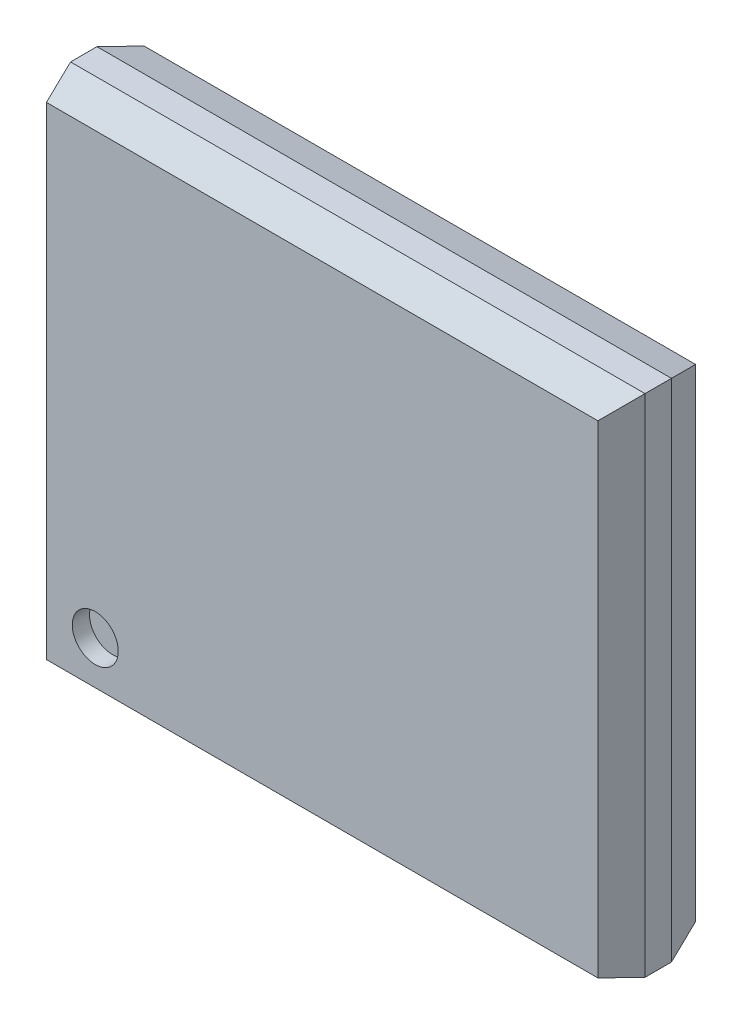
ISO-10303-21;
HEADER;
FILE_DESCRIPTION(('STEP AP214'),'2;1');
FILE_NAME('part.step','',(''),(''),'','','');
FILE_SCHEMA(('AUTOMOTIVE_DESIGN { 1 0 10303 214 1 1 1 1 }'));
ENDSEC;
DATA;
#1=APPLICATION_CONTEXT('core data for automotive mechanical design processes');
#2=APPLICATION_PROTOCOL_DEFINITION('international standard','automotive_design',2000,#1);
#3=PRODUCT_CONTEXT('',#1,'mechanical');
#4=PRODUCT('Part','Part','',(#3));
#5=PRODUCT_RELATED_PRODUCT_CATEGORY('part','',(#4));
#6=PRODUCT_DEFINITION_FORMATION('','',#4);
#7=PRODUCT_DEFINITION_CONTEXT('part definition',#1,'design');
#8=PRODUCT_DEFINITION('design','',#6,#7);
#9=PRODUCT_DEFINITION_SHAPE('','',#8);
#10=(LENGTH_UNIT() NAMED_UNIT(*) SI_UNIT(.MILLI.,.METRE.));
#11=(NAMED_UNIT(*) PLANE_ANGLE_UNIT() SI_UNIT($,.RADIAN.));
#12=(NAMED_UNIT(*) SI_UNIT($,.STERADIAN.) SOLID_ANGLE_UNIT());
#13=UNCERTAINTY_MEASURE_WITH_UNIT(LENGTH_MEASURE(1.E-05),#10,'distance_accuracy_value','');
#14=(GEOMETRIC_REPRESENTATION_CONTEXT(3) GLOBAL_UNCERTAINTY_ASSIGNED_CONTEXT((#13)) GLOBAL_UNIT_ASSIGNED_CONTEXT((#10,
#11,#12)) REPRESENTATION_CONTEXT('',''));
#15=CARTESIAN_POINT('',(0.,0.,0.));
#16=DIRECTION('',(0.,0.,1.));
#17=DIRECTION('',(1.,0.,0.));
#18=AXIS2_PLACEMENT_3D('',#15,#16,#17);
#19=CARTESIAN_POINT('',(0.,2.1,0.15));
#20=DIRECTION('',(0.,0.951708617760523,-0.307002779922846));
#21=DIRECTION('',(-1.,0.,0.));
#22=AXIS2_PLACEMENT_3D('',#19,#20,#21);
#23=PLANE('',#22);
#24=DIRECTION('',(-0.293483635441928,0.293483635441928,0.909799269869777));
#25=VECTOR('',#24,1.);
#26=CARTESIAN_POINT('',(-2.310508182601,2.010508182601,-0.127424633936));
#27=LINE('',#26,#25);
#28=CARTESIAN_POINT('',(-2.4,2.1,0.15));
#29=VERTEX_POINT('',#28);
#30=CARTESIAN_POINT('',(-2.5,2.2,0.46));
#31=VERTEX_POINT('',#30);
#32=EDGE_CURVE('E25',#29,#31,#27,.T.);
#33=ORIENTED_EDGE('',*,*,#32,.T.);
#34=DIRECTION('',(-1.,0.,0.));
#35=VECTOR('',#34,1.);
#36=CARTESIAN_POINT('',(-2.5,2.2,0.46));
#37=LINE('',#36,#35);
#38=CARTESIAN_POINT('',(2.5,2.2,0.46));
#39=VERTEX_POINT('',#38);
#40=EDGE_CURVE('E142',#39,#31,#37,.T.);
#41=ORIENTED_EDGE('',*,*,#40,.F.);
#42=DIRECTION('',(0.293483635441928,0.293483635441928,0.909799269869777));
#43=VECTOR('',#42,1.);
#44=CARTESIAN_POINT('',(2.219121447028,1.919121447028,-0.410723514212));
#45=LINE('',#44,#43);
#46=CARTESIAN_POINT('',(2.4,2.1,0.15));
#47=VERTEX_POINT('',#46);
#48=EDGE_CURVE('E11',#47,#39,#45,.T.);
#49=ORIENTED_EDGE('',*,*,#48,.F.);
#50=DIRECTION('',(1.,0.,0.));
#51=VECTOR('',#50,1.);
#52=CARTESIAN_POINT('',(2.5,2.1,0.15));
#53=LINE('',#52,#51);
#54=EDGE_CURVE('E160',#29,#47,#53,.T.);
#55=ORIENTED_EDGE('',*,*,#54,.F.);
#56=EDGE_LOOP('',(#33,#41,#49,#55));
#57=FACE_BOUND('',#56,.T.);
#58=ADVANCED_FACE('F17',(#57),#23,.T.);
#59=CARTESIAN_POINT('',(2.4,0.,0.15));
#60=DIRECTION('',(0.951708617760523,0.,-0.307002779922846));
#61=DIRECTION('',(0.,-1.,0.));
#62=AXIS2_PLACEMENT_3D('',#59,#60,#61);
#63=PLANE('',#62);
#64=DIRECTION('',(-0.293483635441928,0.293483635441928,-0.909799269869777));
#65=VECTOR('',#64,1.);
#66=CARTESIAN_POINT('',(2.28466838932,-1.98466838932,-0.207527993109));
#67=LINE('',#66,#65);
#68=CARTESIAN_POINT('',(2.5,-2.2,0.46));
#69=VERTEX_POINT('',#68);
#70=CARTESIAN_POINT('',(2.4,-2.1,0.15));
#71=VERTEX_POINT('',#70);
#72=EDGE_CURVE('E37',#69,#71,#67,.T.);
#73=ORIENTED_EDGE('',*,*,#72,.T.);
#74=DIRECTION('',(0.,-1.,0.));
#75=VECTOR('',#74,1.);
#76=CARTESIAN_POINT('',(2.4,-2.2,0.15));
#77=LINE('',#76,#75);
#78=EDGE_CURVE('E163',#47,#71,#77,.T.);
#79=ORIENTED_EDGE('',*,*,#78,.F.);
#80=ORIENTED_EDGE('',*,*,#48,.T.);
#81=DIRECTION('',(0.,1.,0.));
#82=VECTOR('',#81,1.);
#83=CARTESIAN_POINT('',(2.5,2.2,0.46));
#84=LINE('',#83,#82);
#85=EDGE_CURVE('E127',#69,#39,#84,.T.);
#86=ORIENTED_EDGE('',*,*,#85,.F.);
#87=EDGE_LOOP('',(#73,#79,#80,#86));
#88=FACE_BOUND('',#87,.T.);
#89=ADVANCED_FACE('F246',(#88),#63,.T.);
#90=CARTESIAN_POINT('',(-2.5,0.,0.46));
#91=DIRECTION('',(0.951708617760523,0.,0.307002779922846));
#92=DIRECTION('',(0.,-1.,0.));
#93=AXIS2_PLACEMENT_3D('',#90,#91,#92);
#94=PLANE('',#93);
#95=DIRECTION('',(-0.293483635441928,-0.293483635441928,0.909799269869777));
#96=VECTOR('',#95,1.);
#97=CARTESIAN_POINT('',(-2.310508182601,-2.010508182601,-0.127424633936));
#98=LINE('',#97,#96);
#99=CARTESIAN_POINT('',(-2.4,-2.1,0.15));
#100=VERTEX_POINT('',#99);
#101=CARTESIAN_POINT('',(-2.5,-2.2,0.46));
#102=VERTEX_POINT('',#101);
#103=EDGE_CURVE('E218',#100,#102,#98,.T.);
#104=ORIENTED_EDGE('',*,*,#103,.T.);
#105=DIRECTION('',(0.,-1.,0.));
#106=VECTOR('',#105,1.);
#107=CARTESIAN_POINT('',(-2.5,0.,0.46));
#108=LINE('',#107,#106);
#109=EDGE_CURVE('E137',#31,#102,#108,.T.);
#110=ORIENTED_EDGE('',*,*,#109,.F.);
#111=ORIENTED_EDGE('',*,*,#32,.F.);
#112=DIRECTION('',(0.,1.,0.));
#113=VECTOR('',#112,1.);
#114=CARTESIAN_POINT('',(-2.4,0.,0.15));
#115=LINE('',#114,#113);
#116=EDGE_CURVE('E164',#100,#29,#115,.T.);
#117=ORIENTED_EDGE('',*,*,#116,.F.);
#118=EDGE_LOOP('',(#104,#110,#111,#117));
#119=FACE_BOUND('',#118,.T.);
#120=ADVANCED_FACE('F226',(#119),#94,.F.);
#121=CARTESIAN_POINT('',(0.,-2.2,0.46));
#122=DIRECTION('',(0.,0.951708617760523,0.307002779922846));
#123=DIRECTION('',(1.,0.,0.));
#124=AXIS2_PLACEMENT_3D('',#121,#122,#123);
#125=PLANE('',#124);
#126=ORIENTED_EDGE('',*,*,#72,.F.);
#127=DIRECTION('',(1.,0.,0.));
#128=VECTOR('',#127,1.);
#129=CARTESIAN_POINT('',(0.,-2.2,0.46));
#130=LINE('',#129,#128);
#131=EDGE_CURVE('E176',#102,#69,#130,.T.);
#132=ORIENTED_EDGE('',*,*,#131,.F.);
#133=ORIENTED_EDGE('',*,*,#103,.F.);
#134=DIRECTION('',(-1.,0.,0.));
#135=VECTOR('',#134,1.);
#136=CARTESIAN_POINT('',(0.,-2.1,0.15));
#137=LINE('',#136,#135);
#138=EDGE_CURVE('E201',#71,#100,#137,.T.);
#139=ORIENTED_EDGE('',*,*,#138,.F.);
#140=EDGE_LOOP('',(#126,#132,#133,#139));
#141=FACE_BOUND('',#140,.T.);
#142=ADVANCED_FACE('F245',(#141),#125,.F.);
#143=CARTESIAN_POINT('',(-2.4,0.,1.));
#144=DIRECTION('',(-0.951708617760523,0.,0.307002779922846));
#145=DIRECTION('',(0.,1.,0.));
#146=AXIS2_PLACEMENT_3D('',#143,#144,#145);
#147=PLANE('',#146);
#148=DIRECTION('',(-0.293483635441928,0.293483635441928,-0.909799269869777));
#149=VECTOR('',#148,1.);
#150=CARTESIAN_POINT('',(-2.28466838932,1.98466838932,1.357527993109));
#151=LINE('',#150,#149);
#152=CARTESIAN_POINT('',(-2.4,2.1,1.));
#153=VERTEX_POINT('',#152);
#154=CARTESIAN_POINT('',(-2.5,2.2,0.69));
#155=VERTEX_POINT('',#154);
#156=EDGE_CURVE('E115',#153,#155,#151,.T.);
#157=ORIENTED_EDGE('',*,*,#156,.T.);
#158=DIRECTION('',(0.,1.,0.));
#159=VECTOR('',#158,1.);
#160=CARTESIAN_POINT('',(-2.5,2.2,0.69));
#161=LINE('',#160,#159);
#162=CARTESIAN_POINT('',(-2.5,-2.2,0.69));
#163=VERTEX_POINT('',#162);
#164=EDGE_CURVE('E172',#163,#155,#161,.T.);
#165=ORIENTED_EDGE('',*,*,#164,.F.);
#166=DIRECTION('',(-0.293483635441928,-0.293483635441928,-0.909799269869777));
#167=VECTOR('',#166,1.);
#168=CARTESIAN_POINT('',(-2.193281653747,-1.893281653747,1.640826873385));
#169=LINE('',#168,#167);
#170=CARTESIAN_POINT('',(-2.4,-2.1,1.));
#171=VERTEX_POINT('',#170);
#172=EDGE_CURVE('E213',#171,#163,#169,.T.);
#173=ORIENTED_EDGE('',*,*,#172,.F.);
#174=DIRECTION('',(0.,-1.,0.));
#175=VECTOR('',#174,1.);
#176=CARTESIAN_POINT('',(-2.4,-2.2,1.));
#177=LINE('',#176,#175);
#178=EDGE_CURVE('E156',#153,#171,#177,.T.);
#179=ORIENTED_EDGE('',*,*,#178,.F.);
#180=EDGE_LOOP('',(#157,#165,#173,#179));
#181=FACE_BOUND('',#180,.T.);
#182=ADVANCED_FACE('F234',(#181),#147,.T.);
#183=CARTESIAN_POINT('',(0.,-2.1,1.));
#184=DIRECTION('',(0.,-0.951708617760523,0.307002779922846));
#185=DIRECTION('',(-1.,0.,0.));
#186=AXIS2_PLACEMENT_3D('',#183,#184,#185);
#187=PLANE('',#186);
#188=DIRECTION('',(0.293483635441928,-0.293483635441928,-0.909799269869777));
#189=VECTOR('',#188,1.);
#190=CARTESIAN_POINT('',(2.193281653747,-1.893281653747,1.640826873385));
#191=LINE('',#190,#189);
#192=CARTESIAN_POINT('',(2.4,-2.1,1.));
#193=VERTEX_POINT('',#192);
#194=CARTESIAN_POINT('',(2.5,-2.2,0.69));
#195=VERTEX_POINT('',#194);
#196=EDGE_CURVE('E116',#193,#195,#191,.T.);
#197=ORIENTED_EDGE('',*,*,#196,.F.);
#198=DIRECTION('',(1.,0.,0.));
#199=VECTOR('',#198,1.);
#200=CARTESIAN_POINT('',(2.5,-2.1,1.));
#201=LINE('',#200,#199);
#202=EDGE_CURVE('E152',#171,#193,#201,.T.);
#203=ORIENTED_EDGE('',*,*,#202,.F.);
#204=ORIENTED_EDGE('',*,*,#172,.T.);
#205=DIRECTION('',(-1.,0.,0.));
#206=VECTOR('',#205,1.);
#207=CARTESIAN_POINT('',(-2.5,-2.2,0.69));
#208=LINE('',#207,#206);
#209=EDGE_CURVE('E183',#195,#163,#208,.T.);
#210=ORIENTED_EDGE('',*,*,#209,.F.);
#211=EDGE_LOOP('',(#197,#203,#204,#210));
#212=FACE_BOUND('',#211,.T.);
#213=ADVANCED_FACE('F240',(#212),#187,.T.);
#214=CARTESIAN_POINT('',(0.,2.2,0.69));
#215=DIRECTION('',(0.,-0.951708617760523,-0.307002779922846));
#216=DIRECTION('',(0.,0.307002779922846,-0.951708617760523));
#217=AXIS2_PLACEMENT_3D('',#214,#215,#216);
#218=PLANE('',#217);
#219=DIRECTION('',(0.293483635441928,0.293483635441928,-0.909799269869777));
#220=VECTOR('',#219,1.);
#221=CARTESIAN_POINT('',(2.28466838932,1.98466838932,1.357527993109));
#222=LINE('',#221,#220);
#223=CARTESIAN_POINT('',(2.4,2.1,1.));
#224=VERTEX_POINT('',#223);
#225=CARTESIAN_POINT('',(2.5,2.2,0.69));
#226=VERTEX_POINT('',#225);
#227=EDGE_CURVE('E103',#224,#226,#222,.T.);
#228=ORIENTED_EDGE('',*,*,#227,.T.);
#229=DIRECTION('',(1.,0.,0.));
#230=VECTOR('',#229,1.);
#231=CARTESIAN_POINT('',(0.,2.2,0.69));
#232=LINE('',#231,#230);
#233=EDGE_CURVE('E107',#155,#226,#232,.T.);
#234=ORIENTED_EDGE('',*,*,#233,.F.);
#235=ORIENTED_EDGE('',*,*,#156,.F.);
#236=DIRECTION('',(-1.,0.,0.));
#237=VECTOR('',#236,1.);
#238=CARTESIAN_POINT('',(0.,2.1,1.));
#239=LINE('',#238,#237);
#240=EDGE_CURVE('E110',#224,#153,#239,.T.);
#241=ORIENTED_EDGE('',*,*,#240,.F.);
#242=EDGE_LOOP('',(#228,#234,#235,#241));
#243=FACE_BOUND('',#242,.T.);
#244=ADVANCED_FACE('F105',(#243),#218,.F.);
#245=CARTESIAN_POINT('',(2.5,0.,0.69));
#246=DIRECTION('',(-0.951708617760523,0.,-0.307002779922846));
#247=DIRECTION('',(-0.307002779922846,0.,0.951708617760523));
#248=AXIS2_PLACEMENT_3D('',#245,#246,#247);
#249=PLANE('',#248);
#250=ORIENTED_EDGE('',*,*,#196,.T.);
#251=DIRECTION('',(0.,-1.,0.));
#252=VECTOR('',#251,1.);
#253=CARTESIAN_POINT('',(2.5,0.,0.69));
#254=LINE('',#253,#252);
#255=EDGE_CURVE('E119',#226,#195,#254,.T.);
#256=ORIENTED_EDGE('',*,*,#255,.F.);
#257=ORIENTED_EDGE('',*,*,#227,.F.);
#258=DIRECTION('',(0.,1.,0.));
#259=VECTOR('',#258,1.);
#260=CARTESIAN_POINT('',(2.4,0.,1.));
#261=LINE('',#260,#259);
#262=EDGE_CURVE('E126',#193,#224,#261,.T.);
#263=ORIENTED_EDGE('',*,*,#262,.F.);
#264=EDGE_LOOP('',(#250,#256,#257,#263));
#265=FACE_BOUND('',#264,.T.);
#266=ADVANCED_FACE('F120',(#265),#249,.F.);
#267=CARTESIAN_POINT('',(-1.975,-1.725,0.85));
#268=DIRECTION('',(0.,0.,1.));
#269=DIRECTION('',(1.,0.,0.));
#270=AXIS2_PLACEMENT_3D('',#267,#268,#269);
#271=PLANE('',#270);
#272=CARTESIAN_POINT('',(-1.975,-1.725,0.85));
#273=DIRECTION('',(0.,0.,1.));
#274=DIRECTION('',(1.,0.,0.));
#275=AXIS2_PLACEMENT_3D('',#272,#273,#274);
#276=CIRCLE('',#275,0.2);
#277=CARTESIAN_POINT('',(-1.775,-1.725,0.85));
#278=VERTEX_POINT('',#277);
#279=EDGE_CURVE('E205',#278,#278,#276,.T.);
#280=ORIENTED_EDGE('',*,*,#279,.T.);
#281=EDGE_LOOP('',(#280));
#282=FACE_BOUND('',#281,.T.);
#283=ADVANCED_FACE('F406',(#282),#271,.T.);
#284=CARTESIAN_POINT('',(-1.975,-1.725,1.85));
#285=DIRECTION('',(0.,0.,-1.));
#286=DIRECTION('',(-1.,0.,0.));
#287=AXIS2_PLACEMENT_3D('',#284,#285,#286);
#288=CYLINDRICAL_SURFACE('',#287,0.2);
#289=ORIENTED_EDGE('',*,*,#279,.F.);
#290=EDGE_LOOP('',(#289));
#291=FACE_BOUND('',#290,.T.);
#292=CARTESIAN_POINT('',(-1.975,-1.725,1.));
#293=DIRECTION('',(0.,0.,1.));
#294=DIRECTION('',(1.,0.,0.));
#295=AXIS2_PLACEMENT_3D('',#292,#293,#294);
#296=CIRCLE('',#295,0.2);
#297=CARTESIAN_POINT('',(-1.775,-1.725,1.));
#298=VERTEX_POINT('',#297);
#299=EDGE_CURVE('E155',#298,#298,#296,.T.);
#300=ORIENTED_EDGE('',*,*,#299,.T.);
#301=EDGE_LOOP('',(#300));
#302=FACE_BOUND('',#301,.T.);
#303=ADVANCED_FACE('F395',(#291,#302),#288,.F.);
#304=CARTESIAN_POINT('',(0.,0.,0.15));
#305=DIRECTION('',(0.,0.,1.));
#306=DIRECTION('',(1.,0.,0.));
#307=AXIS2_PLACEMENT_3D('',#304,#305,#306);
#308=PLANE('',#307);
#309=ORIENTED_EDGE('',*,*,#116,.T.);
#310=ORIENTED_EDGE('',*,*,#54,.T.);
#311=ORIENTED_EDGE('',*,*,#78,.T.);
#312=ORIENTED_EDGE('',*,*,#138,.T.);
#313=EDGE_LOOP('',(#309,#310,#311,#312));
#314=FACE_BOUND('',#313,.T.);
#315=ADVANCED_FACE('F341',(#314),#308,.F.);
#316=CARTESIAN_POINT('',(0.,0.,1.));
#317=DIRECTION('',(0.,0.,1.));
#318=DIRECTION('',(1.,0.,0.));
#319=AXIS2_PLACEMENT_3D('',#316,#317,#318);
#320=PLANE('',#319);
#321=ORIENTED_EDGE('',*,*,#299,.F.);
#322=EDGE_LOOP('',(#321));
#323=FACE_BOUND('',#322,.T.);
#324=ORIENTED_EDGE('',*,*,#262,.T.);
#325=ORIENTED_EDGE('',*,*,#240,.T.);
#326=ORIENTED_EDGE('',*,*,#178,.T.);
#327=ORIENTED_EDGE('',*,*,#202,.T.);
#328=EDGE_LOOP('',(#324,#325,#326,#327));
#329=FACE_BOUND('',#328,.T.);
#330=ADVANCED_FACE('F238',(#323,#329),#320,.T.);
#331=CARTESIAN_POINT('',(2.5,0.,1.));
#332=DIRECTION('',(1.,0.,0.));
#333=DIRECTION('',(0.,1.,0.));
#334=AXIS2_PLACEMENT_3D('',#331,#332,#333);
#335=PLANE('',#334);
#336=DIRECTION('',(0.,0.,-1.));
#337=VECTOR('',#336,1.);
#338=CARTESIAN_POINT('',(2.5,-2.2,1.));
#339=LINE('',#338,#337);
#340=EDGE_CURVE('E180',#195,#69,#339,.T.);
#341=ORIENTED_EDGE('',*,*,#340,.T.);
#342=ORIENTED_EDGE('',*,*,#85,.T.);
#343=DIRECTION('',(0.,0.,-1.));
#344=VECTOR('',#343,1.);
#345=CARTESIAN_POINT('',(2.5,2.2,1.));
#346=LINE('',#345,#344);
#347=EDGE_CURVE('E133',#226,#39,#346,.T.);
#348=ORIENTED_EDGE('',*,*,#347,.F.);
#349=ORIENTED_EDGE('',*,*,#255,.T.);
#350=EDGE_LOOP('',(#341,#342,#348,#349));
#351=FACE_BOUND('',#350,.T.);
#352=ADVANCED_FACE('F140',(#351),#335,.T.);
#353=CARTESIAN_POINT('',(0.,-2.2,1.));
#354=DIRECTION('',(0.,1.,0.));
#355=DIRECTION('',(1.,0.,0.));
#356=AXIS2_PLACEMENT_3D('',#353,#354,#355);
#357=PLANE('',#356);
#358=DIRECTION('',(0.,0.,-1.));
#359=VECTOR('',#358,1.);
#360=CARTESIAN_POINT('',(-2.5,-2.2,1.));
#361=LINE('',#360,#359);
#362=EDGE_CURVE('E171',#163,#102,#361,.T.);
#363=ORIENTED_EDGE('',*,*,#362,.T.);
#364=ORIENTED_EDGE('',*,*,#131,.T.);
#365=ORIENTED_EDGE('',*,*,#340,.F.);
#366=ORIENTED_EDGE('',*,*,#209,.T.);
#367=EDGE_LOOP('',(#363,#364,#365,#366));
#368=FACE_BOUND('',#367,.T.);
#369=ADVANCED_FACE('F243',(#368),#357,.F.);
#370=CARTESIAN_POINT('',(-2.5,0.,1.));
#371=DIRECTION('',(1.,0.,0.));
#372=DIRECTION('',(0.,1.,0.));
#373=AXIS2_PLACEMENT_3D('',#370,#371,#372);
#374=PLANE('',#373);
#375=DIRECTION('',(0.,0.,-1.));
#376=VECTOR('',#375,1.);
#377=CARTESIAN_POINT('',(-2.5,2.2,1.));
#378=LINE('',#377,#376);
#379=EDGE_CURVE('E135',#155,#31,#378,.T.);
#380=ORIENTED_EDGE('',*,*,#379,.T.);
#381=ORIENTED_EDGE('',*,*,#109,.T.);
#382=ORIENTED_EDGE('',*,*,#362,.F.);
#383=ORIENTED_EDGE('',*,*,#164,.T.);
#384=EDGE_LOOP('',(#380,#381,#382,#383));
#385=FACE_BOUND('',#384,.T.);
#386=ADVANCED_FACE('F230',(#385),#374,.F.);
#387=CARTESIAN_POINT('',(0.,2.2,1.));
#388=DIRECTION('',(0.,1.,0.));
#389=DIRECTION('',(1.,0.,0.));
#390=AXIS2_PLACEMENT_3D('',#387,#388,#389);
#391=PLANE('',#390);
#392=ORIENTED_EDGE('',*,*,#347,.T.);
#393=ORIENTED_EDGE('',*,*,#40,.T.);
#394=ORIENTED_EDGE('',*,*,#379,.F.);
#395=ORIENTED_EDGE('',*,*,#233,.T.);
#396=EDGE_LOOP('',(#392,#393,#394,#395));
#397=FACE_BOUND('',#396,.T.);
#398=ADVANCED_FACE('F131',(#397),#391,.T.);
#399=CLOSED_SHELL('',(#58,#89,#120,#142,#182,#213,#244,#266,#283,#303,#315,#330,#352,#369,#386,#398));
#400=MANIFOLD_SOLID_BREP('B1',#399);
#401=ADVANCED_BREP_SHAPE_REPRESENTATION('',(#18,#400),#14);
#402=SHAPE_DEFINITION_REPRESENTATION(#9,#401);
ENDSEC;
END-ISO-10303-21;
